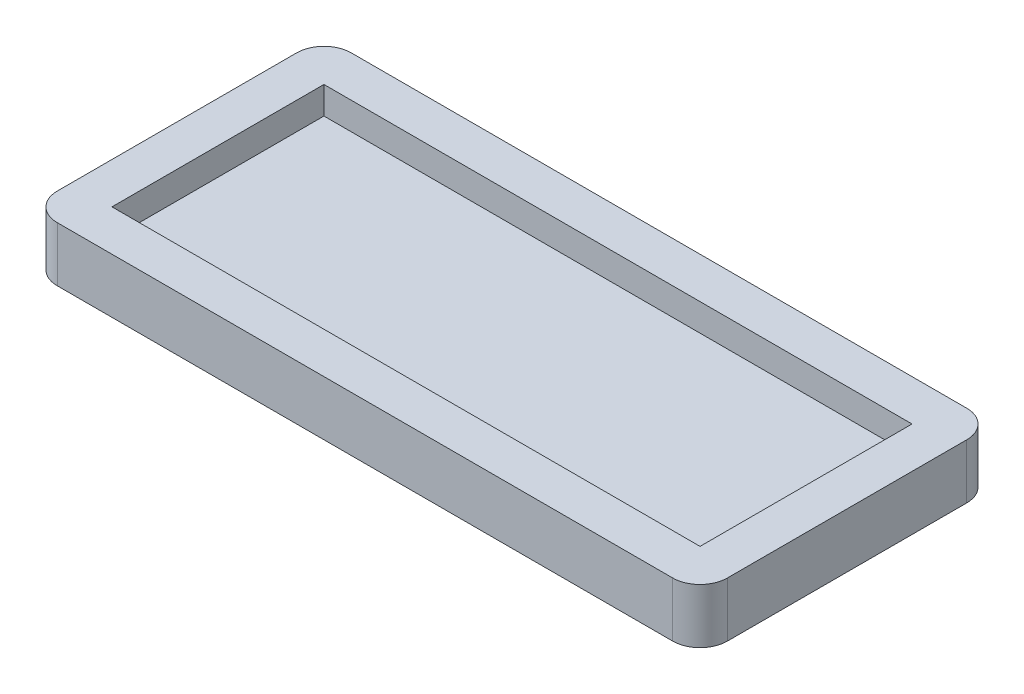
ISO-10303-21;
HEADER;
FILE_DESCRIPTION(('STEP AP214'),'2;1');
FILE_NAME('part.step','',(''),(''),'','','');
FILE_SCHEMA(('AUTOMOTIVE_DESIGN { 1 0 10303 214 1 1 1 1 }'));
ENDSEC;
DATA;
#1=APPLICATION_CONTEXT('core data for automotive mechanical design processes');
#2=APPLICATION_PROTOCOL_DEFINITION('international standard','automotive_design',2000,#1);
#3=PRODUCT_CONTEXT('',#1,'mechanical');
#4=PRODUCT('Part','Part','',(#3));
#5=PRODUCT_RELATED_PRODUCT_CATEGORY('part','',(#4));
#6=PRODUCT_DEFINITION_FORMATION('','',#4);
#7=PRODUCT_DEFINITION_CONTEXT('part definition',#1,'design');
#8=PRODUCT_DEFINITION('design','',#6,#7);
#9=PRODUCT_DEFINITION_SHAPE('','',#8);
#10=(LENGTH_UNIT() NAMED_UNIT(*) SI_UNIT(.MILLI.,.METRE.));
#11=(NAMED_UNIT(*) PLANE_ANGLE_UNIT() SI_UNIT($,.RADIAN.));
#12=(NAMED_UNIT(*) SI_UNIT($,.STERADIAN.) SOLID_ANGLE_UNIT());
#13=UNCERTAINTY_MEASURE_WITH_UNIT(LENGTH_MEASURE(1.E-05),#10,'distance_accuracy_value','');
#14=(GEOMETRIC_REPRESENTATION_CONTEXT(3) GLOBAL_UNCERTAINTY_ASSIGNED_CONTEXT((#13)) GLOBAL_UNIT_ASSIGNED_CONTEXT((#10,
#11,#12)) REPRESENTATION_CONTEXT('',''));
#15=CARTESIAN_POINT('',(0.,0.,0.));
#16=DIRECTION('',(0.,0.,1.));
#17=DIRECTION('',(1.,0.,0.));
#18=AXIS2_PLACEMENT_3D('',#15,#16,#17);
#19=CARTESIAN_POINT('',(-22.5,2.,8.75));
#20=DIRECTION('',(0.,1.,0.));
#21=DIRECTION('',(0.,0.,1.));
#22=AXIS2_PLACEMENT_3D('',#19,#20,#21);
#23=PLANE('',#22);
#24=CARTESIAN_POINT('',(-22.5,2.,8.75));
#25=DIRECTION('',(0.,1.,0.));
#26=DIRECTION('',(0.,0.,1.));
#27=AXIS2_PLACEMENT_3D('',#24,#25,#26);
#28=CIRCLE('',#27,2.);
#29=CARTESIAN_POINT('',(-24.5,2.,8.75));
#30=VERTEX_POINT('',#29);
#31=CARTESIAN_POINT('',(-22.5,2.,10.75));
#32=VERTEX_POINT('',#31);
#33=EDGE_CURVE('E187',#30,#32,#28,.T.);
#34=ORIENTED_EDGE('',*,*,#33,.T.);
#35=DIRECTION('',(1.,0.,0.));
#36=VECTOR('',#35,1.);
#37=CARTESIAN_POINT('',(-22.5,2.,10.75));
#38=LINE('',#37,#36);
#39=CARTESIAN_POINT('',(22.5,2.,10.75));
#40=VERTEX_POINT('',#39);
#41=EDGE_CURVE('E126',#32,#40,#38,.T.);
#42=ORIENTED_EDGE('',*,*,#41,.T.);
#43=CARTESIAN_POINT('',(22.5,2.,8.75));
#44=DIRECTION('',(0.,1.,0.));
#45=DIRECTION('',(0.,0.,1.));
#46=AXIS2_PLACEMENT_3D('',#43,#44,#45);
#47=CIRCLE('',#46,2.);
#48=CARTESIAN_POINT('',(24.5,2.,8.75));
#49=VERTEX_POINT('',#48);
#50=EDGE_CURVE('E190',#40,#49,#47,.T.);
#51=ORIENTED_EDGE('',*,*,#50,.T.);
#52=DIRECTION('',(0.,0.,-1.));
#53=VECTOR('',#52,1.);
#54=CARTESIAN_POINT('',(24.5,2.,-8.75));
#55=LINE('',#54,#53);
#56=CARTESIAN_POINT('',(24.5,2.,-8.75));
#57=VERTEX_POINT('',#56);
#58=EDGE_CURVE('E192',#49,#57,#55,.T.);
#59=ORIENTED_EDGE('',*,*,#58,.T.);
#60=CARTESIAN_POINT('',(22.5,2.,-8.75));
#61=DIRECTION('',(0.,1.,0.));
#62=DIRECTION('',(0.,0.,1.));
#63=AXIS2_PLACEMENT_3D('',#60,#61,#62);
#64=CIRCLE('',#63,2.);
#65=CARTESIAN_POINT('',(22.5,2.,-10.75));
#66=VERTEX_POINT('',#65);
#67=EDGE_CURVE('E194',#57,#66,#64,.T.);
#68=ORIENTED_EDGE('',*,*,#67,.T.);
#69=DIRECTION('',(-1.,0.,0.));
#70=VECTOR('',#69,1.);
#71=CARTESIAN_POINT('',(-22.5,2.,-10.75));
#72=LINE('',#71,#70);
#73=CARTESIAN_POINT('',(-22.5,2.,-10.75));
#74=VERTEX_POINT('',#73);
#75=EDGE_CURVE('E196',#66,#74,#72,.T.);
#76=ORIENTED_EDGE('',*,*,#75,.T.);
#77=CARTESIAN_POINT('',(-22.5,2.,-8.75));
#78=DIRECTION('',(0.,1.,0.));
#79=DIRECTION('',(0.,0.,-1.));
#80=AXIS2_PLACEMENT_3D('',#77,#78,#79);
#81=CIRCLE('',#80,2.);
#82=CARTESIAN_POINT('',(-24.5,2.,-8.75));
#83=VERTEX_POINT('',#82);
#84=EDGE_CURVE('E198',#74,#83,#81,.T.);
#85=ORIENTED_EDGE('',*,*,#84,.T.);
#86=DIRECTION('',(0.,0.,1.));
#87=VECTOR('',#86,1.);
#88=CARTESIAN_POINT('',(-24.5,2.,-8.75));
#89=LINE('',#88,#87);
#90=EDGE_CURVE('E56',#83,#30,#89,.T.);
#91=ORIENTED_EDGE('',*,*,#90,.T.);
#92=EDGE_LOOP('',(#34,#42,#51,#59,#68,#76,#85,#91));
#93=FACE_BOUND('',#92,.T.);
#94=DIRECTION('',(1.,0.,0.));
#95=VECTOR('',#94,1.);
#96=CARTESIAN_POINT('',(-21.5,2.,7.75));
#97=LINE('',#96,#95);
#98=CARTESIAN_POINT('',(-21.5,2.,7.75));
#99=VERTEX_POINT('',#98);
#100=CARTESIAN_POINT('',(21.5,2.,7.75));
#101=VERTEX_POINT('',#100);
#102=EDGE_CURVE('E162',#99,#101,#97,.T.);
#103=ORIENTED_EDGE('',*,*,#102,.F.);
#104=DIRECTION('',(0.,0.,1.));
#105=VECTOR('',#104,1.);
#106=CARTESIAN_POINT('',(-21.5,2.,-7.75));
#107=LINE('',#106,#105);
#108=CARTESIAN_POINT('',(-21.5,2.,-7.75));
#109=VERTEX_POINT('',#108);
#110=EDGE_CURVE('E160',#109,#99,#107,.T.);
#111=ORIENTED_EDGE('',*,*,#110,.F.);
#112=DIRECTION('',(-1.,0.,0.));
#113=VECTOR('',#112,1.);
#114=CARTESIAN_POINT('',(-21.5,2.,-7.75));
#115=LINE('',#114,#113);
#116=CARTESIAN_POINT('',(21.5,2.,-7.75));
#117=VERTEX_POINT('',#116);
#118=EDGE_CURVE('E167',#117,#109,#115,.T.);
#119=ORIENTED_EDGE('',*,*,#118,.F.);
#120=DIRECTION('',(0.,0.,-1.));
#121=VECTOR('',#120,1.);
#122=CARTESIAN_POINT('',(21.5,2.,-7.75));
#123=LINE('',#122,#121);
#124=EDGE_CURVE('E165',#101,#117,#123,.T.);
#125=ORIENTED_EDGE('',*,*,#124,.F.);
#126=EDGE_LOOP('',(#103,#111,#119,#125));
#127=FACE_BOUND('',#126,.T.);
#128=ADVANCED_FACE('F33',(#93,#127),#23,.T.);
#129=CARTESIAN_POINT('',(-22.5,2.,8.75));
#130=DIRECTION('',(0.,-1.,0.));
#131=DIRECTION('',(0.,0.,-1.));
#132=AXIS2_PLACEMENT_3D('',#129,#130,#131);
#133=CYLINDRICAL_SURFACE('',#132,2.);
#134=DIRECTION('',(0.,-1.,0.));
#135=VECTOR('',#134,1.);
#136=CARTESIAN_POINT('',(-24.5,2.,8.75));
#137=LINE('',#136,#135);
#138=CARTESIAN_POINT('',(-24.5,-2.,8.75));
#139=VERTEX_POINT('',#138);
#140=EDGE_CURVE('E141',#30,#139,#137,.T.);
#141=ORIENTED_EDGE('',*,*,#140,.T.);
#142=CARTESIAN_POINT('',(-22.5,-2.,8.75));
#143=DIRECTION('',(0.,1.,0.));
#144=DIRECTION('',(0.,0.,1.));
#145=AXIS2_PLACEMENT_3D('',#142,#143,#144);
#146=CIRCLE('',#145,2.);
#147=CARTESIAN_POINT('',(-22.5,-2.,10.75));
#148=VERTEX_POINT('',#147);
#149=EDGE_CURVE('E135',#139,#148,#146,.T.);
#150=ORIENTED_EDGE('',*,*,#149,.T.);
#151=DIRECTION('',(0.,-1.,0.));
#152=VECTOR('',#151,1.);
#153=CARTESIAN_POINT('',(-22.5,2.,10.75));
#154=LINE('',#153,#152);
#155=EDGE_CURVE('E11',#32,#148,#154,.T.);
#156=ORIENTED_EDGE('',*,*,#155,.F.);
#157=ORIENTED_EDGE('',*,*,#33,.F.);
#158=EDGE_LOOP('',(#141,#150,#156,#157));
#159=FACE_BOUND('',#158,.T.);
#160=ADVANCED_FACE('F35',(#159),#133,.T.);
#161=CARTESIAN_POINT('',(-22.5,2.,10.75));
#162=DIRECTION('',(0.,0.,-1.));
#163=DIRECTION('',(-1.,0.,0.));
#164=AXIS2_PLACEMENT_3D('',#161,#162,#163);
#165=PLANE('',#164);
#166=ORIENTED_EDGE('',*,*,#155,.T.);
#167=DIRECTION('',(1.,0.,0.));
#168=VECTOR('',#167,1.);
#169=CARTESIAN_POINT('',(-22.5,-2.,10.75));
#170=LINE('',#169,#168);
#171=CARTESIAN_POINT('',(22.5,-2.,10.75));
#172=VERTEX_POINT('',#171);
#173=EDGE_CURVE('E125',#148,#172,#170,.T.);
#174=ORIENTED_EDGE('',*,*,#173,.T.);
#175=DIRECTION('',(0.,-1.,0.));
#176=VECTOR('',#175,1.);
#177=CARTESIAN_POINT('',(22.5,2.,10.75));
#178=LINE('',#177,#176);
#179=EDGE_CURVE('E41',#40,#172,#178,.T.);
#180=ORIENTED_EDGE('',*,*,#179,.F.);
#181=ORIENTED_EDGE('',*,*,#41,.F.);
#182=EDGE_LOOP('',(#166,#174,#180,#181));
#183=FACE_BOUND('',#182,.T.);
#184=ADVANCED_FACE('F123',(#183),#165,.F.);
#185=CARTESIAN_POINT('',(22.5,2.,8.75));
#186=DIRECTION('',(0.,-1.,0.));
#187=DIRECTION('',(0.,0.,-1.));
#188=AXIS2_PLACEMENT_3D('',#185,#186,#187);
#189=CYLINDRICAL_SURFACE('',#188,2.);
#190=ORIENTED_EDGE('',*,*,#179,.T.);
#191=CARTESIAN_POINT('',(22.5,-2.,8.75));
#192=DIRECTION('',(0.,1.,0.));
#193=DIRECTION('',(0.,0.,1.));
#194=AXIS2_PLACEMENT_3D('',#191,#192,#193);
#195=CIRCLE('',#194,2.);
#196=CARTESIAN_POINT('',(24.5,-2.,8.75));
#197=VERTEX_POINT('',#196);
#198=EDGE_CURVE('E139',#172,#197,#195,.T.);
#199=ORIENTED_EDGE('',*,*,#198,.T.);
#200=DIRECTION('',(0.,-1.,0.));
#201=VECTOR('',#200,1.);
#202=CARTESIAN_POINT('',(24.5,2.,8.75));
#203=LINE('',#202,#201);
#204=EDGE_CURVE('E210',#49,#197,#203,.T.);
#205=ORIENTED_EDGE('',*,*,#204,.F.);
#206=ORIENTED_EDGE('',*,*,#50,.F.);
#207=EDGE_LOOP('',(#190,#199,#205,#206));
#208=FACE_BOUND('',#207,.T.);
#209=ADVANCED_FACE('F213',(#208),#189,.T.);
#210=CARTESIAN_POINT('',(24.5,2.,-8.75));
#211=DIRECTION('',(-1.,0.,0.));
#212=DIRECTION('',(0.,0.,1.));
#213=AXIS2_PLACEMENT_3D('',#210,#211,#212);
#214=PLANE('',#213);
#215=ORIENTED_EDGE('',*,*,#204,.T.);
#216=DIRECTION('',(0.,0.,-1.));
#217=VECTOR('',#216,1.);
#218=CARTESIAN_POINT('',(24.5,-2.,8.75));
#219=LINE('',#218,#217);
#220=CARTESIAN_POINT('',(24.5,-2.,-8.75));
#221=VERTEX_POINT('',#220);
#222=EDGE_CURVE('E145',#197,#221,#219,.T.);
#223=ORIENTED_EDGE('',*,*,#222,.T.);
#224=DIRECTION('',(0.,-1.,0.));
#225=VECTOR('',#224,1.);
#226=CARTESIAN_POINT('',(24.5,2.,-8.75));
#227=LINE('',#226,#225);
#228=EDGE_CURVE('E208',#57,#221,#227,.T.);
#229=ORIENTED_EDGE('',*,*,#228,.F.);
#230=ORIENTED_EDGE('',*,*,#58,.F.);
#231=EDGE_LOOP('',(#215,#223,#229,#230));
#232=FACE_BOUND('',#231,.T.);
#233=ADVANCED_FACE('F221',(#232),#214,.F.);
#234=CARTESIAN_POINT('',(22.5,2.,-8.75));
#235=DIRECTION('',(0.,-1.,0.));
#236=DIRECTION('',(0.,0.,-1.));
#237=AXIS2_PLACEMENT_3D('',#234,#235,#236);
#238=CYLINDRICAL_SURFACE('',#237,2.);
#239=ORIENTED_EDGE('',*,*,#228,.T.);
#240=CARTESIAN_POINT('',(22.5,-2.,-8.75));
#241=DIRECTION('',(0.,1.,0.));
#242=DIRECTION('',(0.,0.,1.));
#243=AXIS2_PLACEMENT_3D('',#240,#241,#242);
#244=CIRCLE('',#243,2.);
#245=CARTESIAN_POINT('',(22.5,-2.,-10.75));
#246=VERTEX_POINT('',#245);
#247=EDGE_CURVE('E148',#221,#246,#244,.T.);
#248=ORIENTED_EDGE('',*,*,#247,.T.);
#249=DIRECTION('',(0.,-1.,0.));
#250=VECTOR('',#249,1.);
#251=CARTESIAN_POINT('',(22.5,2.,-10.75));
#252=LINE('',#251,#250);
#253=EDGE_CURVE('E206',#66,#246,#252,.T.);
#254=ORIENTED_EDGE('',*,*,#253,.F.);
#255=ORIENTED_EDGE('',*,*,#67,.F.);
#256=EDGE_LOOP('',(#239,#248,#254,#255));
#257=FACE_BOUND('',#256,.T.);
#258=ADVANCED_FACE('F224',(#257),#238,.T.);
#259=CARTESIAN_POINT('',(-22.5,2.,-10.75));
#260=DIRECTION('',(0.,0.,1.));
#261=DIRECTION('',(1.,0.,0.));
#262=AXIS2_PLACEMENT_3D('',#259,#260,#261);
#263=PLANE('',#262);
#264=ORIENTED_EDGE('',*,*,#253,.T.);
#265=DIRECTION('',(-1.,0.,0.));
#266=VECTOR('',#265,1.);
#267=CARTESIAN_POINT('',(22.5,-2.,-10.75));
#268=LINE('',#267,#266);
#269=CARTESIAN_POINT('',(-22.5,-2.,-10.75));
#270=VERTEX_POINT('',#269);
#271=EDGE_CURVE('E151',#246,#270,#268,.T.);
#272=ORIENTED_EDGE('',*,*,#271,.T.);
#273=DIRECTION('',(0.,-1.,0.));
#274=VECTOR('',#273,1.);
#275=CARTESIAN_POINT('',(-22.5,2.,-10.75));
#276=LINE('',#275,#274);
#277=EDGE_CURVE('E204',#74,#270,#276,.T.);
#278=ORIENTED_EDGE('',*,*,#277,.F.);
#279=ORIENTED_EDGE('',*,*,#75,.F.);
#280=EDGE_LOOP('',(#264,#272,#278,#279));
#281=FACE_BOUND('',#280,.T.);
#282=ADVANCED_FACE('F229',(#281),#263,.F.);
#283=CARTESIAN_POINT('',(-22.5,2.,-8.75));
#284=DIRECTION('',(0.,-1.,0.));
#285=DIRECTION('',(0.,0.,-1.));
#286=AXIS2_PLACEMENT_3D('',#283,#284,#285);
#287=CYLINDRICAL_SURFACE('',#286,2.);
#288=ORIENTED_EDGE('',*,*,#277,.T.);
#289=CARTESIAN_POINT('',(-22.5,-2.,-8.75));
#290=DIRECTION('',(0.,1.,0.));
#291=DIRECTION('',(0.,0.,1.));
#292=AXIS2_PLACEMENT_3D('',#289,#290,#291);
#293=CIRCLE('',#292,2.);
#294=CARTESIAN_POINT('',(-24.5,-2.,-8.75));
#295=VERTEX_POINT('',#294);
#296=EDGE_CURVE('E154',#270,#295,#293,.T.);
#297=ORIENTED_EDGE('',*,*,#296,.T.);
#298=DIRECTION('',(0.,-1.,0.));
#299=VECTOR('',#298,1.);
#300=CARTESIAN_POINT('',(-24.5,2.,-8.75));
#301=LINE('',#300,#299);
#302=EDGE_CURVE('E202',#83,#295,#301,.T.);
#303=ORIENTED_EDGE('',*,*,#302,.F.);
#304=ORIENTED_EDGE('',*,*,#84,.F.);
#305=EDGE_LOOP('',(#288,#297,#303,#304));
#306=FACE_BOUND('',#305,.T.);
#307=ADVANCED_FACE('F233',(#306),#287,.T.);
#308=CARTESIAN_POINT('',(-24.5,2.,-8.75));
#309=DIRECTION('',(1.,0.,0.));
#310=DIRECTION('',(0.,0.,-1.));
#311=AXIS2_PLACEMENT_3D('',#308,#309,#310);
#312=PLANE('',#311);
#313=ORIENTED_EDGE('',*,*,#302,.T.);
#314=DIRECTION('',(0.,0.,1.));
#315=VECTOR('',#314,1.);
#316=CARTESIAN_POINT('',(-24.5,-2.,-8.75));
#317=LINE('',#316,#315);
#318=EDGE_CURVE('E157',#295,#139,#317,.T.);
#319=ORIENTED_EDGE('',*,*,#318,.T.);
#320=ORIENTED_EDGE('',*,*,#140,.F.);
#321=ORIENTED_EDGE('',*,*,#90,.F.);
#322=EDGE_LOOP('',(#313,#319,#320,#321));
#323=FACE_BOUND('',#322,.T.);
#324=ADVANCED_FACE('F236',(#323),#312,.F.);
#325=CARTESIAN_POINT('',(-21.5,2.,-7.75));
#326=DIRECTION('',(1.,0.,0.));
#327=DIRECTION('',(0.,0.,-1.));
#328=AXIS2_PLACEMENT_3D('',#325,#326,#327);
#329=PLANE('',#328);
#330=DIRECTION('',(0.,0.,1.));
#331=VECTOR('',#330,1.);
#332=CARTESIAN_POINT('',(-21.5,0.,-7.75));
#333=LINE('',#332,#331);
#334=CARTESIAN_POINT('',(-21.5,0.,-7.75));
#335=VERTEX_POINT('',#334);
#336=CARTESIAN_POINT('',(-21.5,0.,7.75));
#337=VERTEX_POINT('',#336);
#338=EDGE_CURVE('E159',#335,#337,#333,.T.);
#339=ORIENTED_EDGE('',*,*,#338,.F.);
#340=DIRECTION('',(0.,-1.,0.));
#341=VECTOR('',#340,1.);
#342=CARTESIAN_POINT('',(-21.5,2.,-7.75));
#343=LINE('',#342,#341);
#344=EDGE_CURVE('E169',#109,#335,#343,.T.);
#345=ORIENTED_EDGE('',*,*,#344,.F.);
#346=ORIENTED_EDGE('',*,*,#110,.T.);
#347=DIRECTION('',(0.,-1.,0.));
#348=VECTOR('',#347,1.);
#349=CARTESIAN_POINT('',(-21.5,2.,7.75));
#350=LINE('',#349,#348);
#351=EDGE_CURVE('E184',#99,#337,#350,.T.);
#352=ORIENTED_EDGE('',*,*,#351,.T.);
#353=EDGE_LOOP('',(#339,#345,#346,#352));
#354=FACE_BOUND('',#353,.T.);
#355=ADVANCED_FACE('F238',(#354),#329,.T.);
#356=CARTESIAN_POINT('',(-21.5,2.,7.75));
#357=DIRECTION('',(0.,0.,-1.));
#358=DIRECTION('',(-1.,0.,0.));
#359=AXIS2_PLACEMENT_3D('',#356,#357,#358);
#360=PLANE('',#359);
#361=DIRECTION('',(1.,0.,0.));
#362=VECTOR('',#361,1.);
#363=CARTESIAN_POINT('',(-21.5,0.,7.75));
#364=LINE('',#363,#362);
#365=CARTESIAN_POINT('',(21.5,0.,7.75));
#366=VERTEX_POINT('',#365);
#367=EDGE_CURVE('E172',#337,#366,#364,.T.);
#368=ORIENTED_EDGE('',*,*,#367,.F.);
#369=ORIENTED_EDGE('',*,*,#351,.F.);
#370=ORIENTED_EDGE('',*,*,#102,.T.);
#371=DIRECTION('',(0.,-1.,0.));
#372=VECTOR('',#371,1.);
#373=CARTESIAN_POINT('',(21.5,2.,7.75));
#374=LINE('',#373,#372);
#375=EDGE_CURVE('E182',#101,#366,#374,.T.);
#376=ORIENTED_EDGE('',*,*,#375,.T.);
#377=EDGE_LOOP('',(#368,#369,#370,#376));
#378=FACE_BOUND('',#377,.T.);
#379=ADVANCED_FACE('F244',(#378),#360,.T.);
#380=CARTESIAN_POINT('',(21.5,2.,-7.75));
#381=DIRECTION('',(-1.,0.,0.));
#382=DIRECTION('',(0.,0.,1.));
#383=AXIS2_PLACEMENT_3D('',#380,#381,#382);
#384=PLANE('',#383);
#385=DIRECTION('',(0.,0.,-1.));
#386=VECTOR('',#385,1.);
#387=CARTESIAN_POINT('',(21.5,0.,-7.75));
#388=LINE('',#387,#386);
#389=CARTESIAN_POINT('',(21.5,0.,-7.75));
#390=VERTEX_POINT('',#389);
#391=EDGE_CURVE('E175',#366,#390,#388,.T.);
#392=ORIENTED_EDGE('',*,*,#391,.F.);
#393=ORIENTED_EDGE('',*,*,#375,.F.);
#394=ORIENTED_EDGE('',*,*,#124,.T.);
#395=DIRECTION('',(0.,-1.,0.));
#396=VECTOR('',#395,1.);
#397=CARTESIAN_POINT('',(21.5,2.,-7.75));
#398=LINE('',#397,#396);
#399=EDGE_CURVE('E48',#117,#390,#398,.T.);
#400=ORIENTED_EDGE('',*,*,#399,.T.);
#401=EDGE_LOOP('',(#392,#393,#394,#400));
#402=FACE_BOUND('',#401,.T.);
#403=ADVANCED_FACE('F256',(#402),#384,.T.);
#404=CARTESIAN_POINT('',(-21.5,2.,-7.75));
#405=DIRECTION('',(0.,0.,1.));
#406=DIRECTION('',(1.,0.,0.));
#407=AXIS2_PLACEMENT_3D('',#404,#405,#406);
#408=PLANE('',#407);
#409=DIRECTION('',(-1.,0.,0.));
#410=VECTOR('',#409,1.);
#411=CARTESIAN_POINT('',(-21.5,0.,-7.75));
#412=LINE('',#411,#410);
#413=EDGE_CURVE('E163',#390,#335,#412,.T.);
#414=ORIENTED_EDGE('',*,*,#413,.F.);
#415=ORIENTED_EDGE('',*,*,#399,.F.);
#416=ORIENTED_EDGE('',*,*,#118,.T.);
#417=ORIENTED_EDGE('',*,*,#344,.T.);
#418=EDGE_LOOP('',(#414,#415,#416,#417));
#419=FACE_BOUND('',#418,.T.);
#420=ADVANCED_FACE('F260',(#419),#408,.T.);
#421=CARTESIAN_POINT('',(-22.5,0.,8.75));
#422=DIRECTION('',(0.,1.,0.));
#423=DIRECTION('',(0.,0.,1.));
#424=AXIS2_PLACEMENT_3D('',#421,#422,#423);
#425=PLANE('',#424);
#426=ORIENTED_EDGE('',*,*,#413,.T.);
#427=ORIENTED_EDGE('',*,*,#338,.T.);
#428=ORIENTED_EDGE('',*,*,#367,.T.);
#429=ORIENTED_EDGE('',*,*,#391,.T.);
#430=EDGE_LOOP('',(#426,#427,#428,#429));
#431=FACE_BOUND('',#430,.T.);
#432=ADVANCED_FACE('F264',(#431),#425,.T.);
#433=CARTESIAN_POINT('',(-22.5,-2.,8.75));
#434=DIRECTION('',(0.,1.,0.));
#435=DIRECTION('',(0.,0.,1.));
#436=AXIS2_PLACEMENT_3D('',#433,#434,#435);
#437=PLANE('',#436);
#438=ORIENTED_EDGE('',*,*,#149,.F.);
#439=ORIENTED_EDGE('',*,*,#318,.F.);
#440=ORIENTED_EDGE('',*,*,#296,.F.);
#441=ORIENTED_EDGE('',*,*,#271,.F.);
#442=ORIENTED_EDGE('',*,*,#247,.F.);
#443=ORIENTED_EDGE('',*,*,#222,.F.);
#444=ORIENTED_EDGE('',*,*,#198,.F.);
#445=ORIENTED_EDGE('',*,*,#173,.F.);
#446=EDGE_LOOP('',(#438,#439,#440,#441,#442,#443,#444,#445));
#447=FACE_BOUND('',#446,.T.);
#448=ADVANCED_FACE('F133',(#447),#437,.F.);
#449=CLOSED_SHELL('',(#128,#160,#184,#209,#233,#258,#282,#307,#324,#355,#379,#403,#420,#432,#448));
#450=MANIFOLD_SOLID_BREP('B2',#449);
#451=ADVANCED_BREP_SHAPE_REPRESENTATION('',(#18,#450),#14);
#452=SHAPE_DEFINITION_REPRESENTATION(#9,#451);
ENDSEC;
END-ISO-10303-21;
